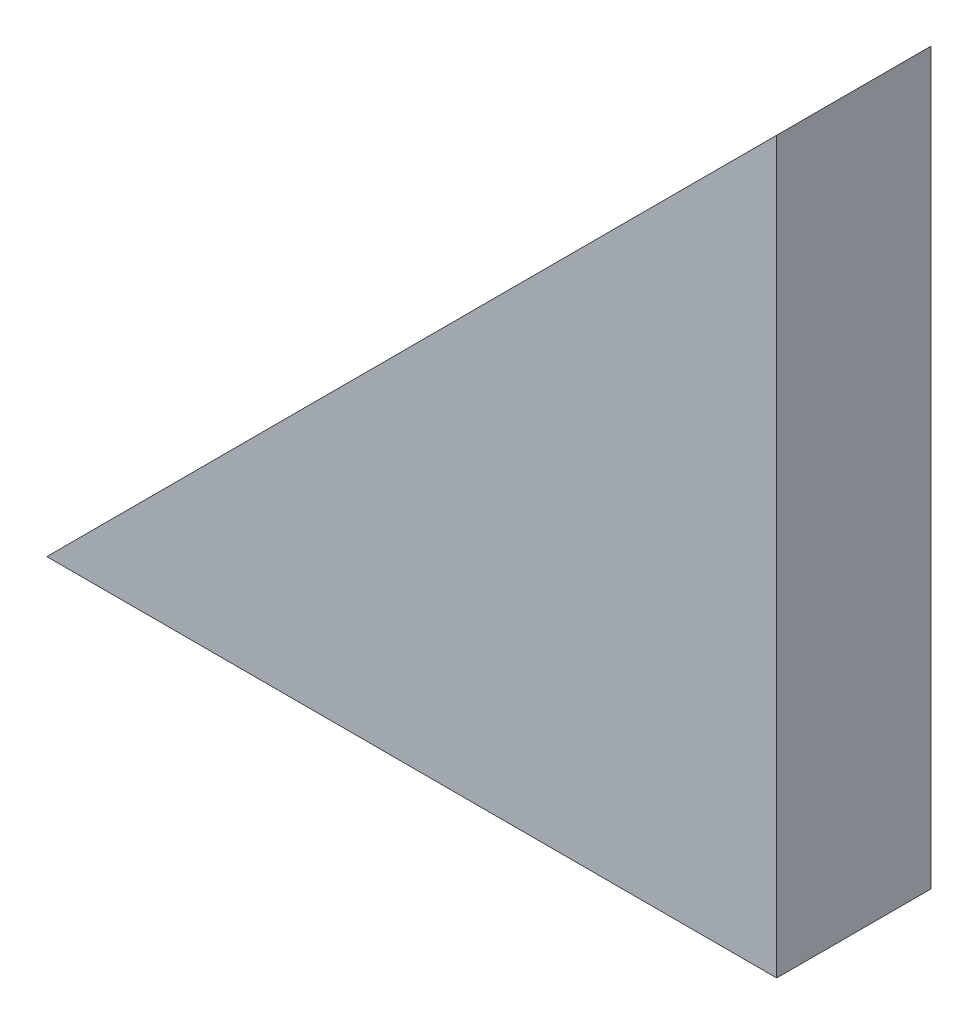
ISO-10303-21;
HEADER;
FILE_DESCRIPTION(('STEP AP214'),'2;1');
FILE_NAME('part.step','',(''),(''),'','','');
FILE_SCHEMA(('AUTOMOTIVE_DESIGN { 1 0 10303 214 1 1 1 1 }'));
ENDSEC;
DATA;
#1=APPLICATION_CONTEXT('core data for automotive mechanical design processes');
#2=APPLICATION_PROTOCOL_DEFINITION('international standard','automotive_design',2000,#1);
#3=PRODUCT_CONTEXT('',#1,'mechanical');
#4=PRODUCT('Part','Part','',(#3));
#5=PRODUCT_RELATED_PRODUCT_CATEGORY('part','',(#4));
#6=PRODUCT_DEFINITION_FORMATION('','',#4);
#7=PRODUCT_DEFINITION_CONTEXT('part definition',#1,'design');
#8=PRODUCT_DEFINITION('design','',#6,#7);
#9=PRODUCT_DEFINITION_SHAPE('','',#8);
#10=(LENGTH_UNIT() NAMED_UNIT(*) SI_UNIT(.MILLI.,.METRE.));
#11=(NAMED_UNIT(*) PLANE_ANGLE_UNIT() SI_UNIT($,.RADIAN.));
#12=(NAMED_UNIT(*) SI_UNIT($,.STERADIAN.) SOLID_ANGLE_UNIT());
#13=UNCERTAINTY_MEASURE_WITH_UNIT(LENGTH_MEASURE(1.E-05),#10,'distance_accuracy_value','');
#14=(GEOMETRIC_REPRESENTATION_CONTEXT(3) GLOBAL_UNCERTAINTY_ASSIGNED_CONTEXT((#13)) GLOBAL_UNIT_ASSIGNED_CONTEXT((#10,
#11,#12)) REPRESENTATION_CONTEXT('',''));
#15=CARTESIAN_POINT('',(0.,0.,0.));
#16=DIRECTION('',(0.,0.,1.));
#17=DIRECTION('',(1.,0.,0.));
#18=AXIS2_PLACEMENT_3D('',#15,#16,#17);
#19=CARTESIAN_POINT('',(0.,0.,9.525));
#20=DIRECTION('',(-1.,0.,0.));
#21=DIRECTION('',(0.,0.,1.));
#22=AXIS2_PLACEMENT_3D('',#19,#20,#21);
#23=PLANE('',#22);
#24=DIRECTION('',(0.,1.,0.));
#25=VECTOR('',#24,1.);
#26=CARTESIAN_POINT('',(0.,0.,0.));
#27=LINE('',#26,#25);
#28=CARTESIAN_POINT('',(0.,0.,0.));
#29=VERTEX_POINT('',#28);
#30=CARTESIAN_POINT('',(0.,45.,0.));
#31=VERTEX_POINT('',#30);
#32=EDGE_CURVE('E81',#29,#31,#27,.T.);
#33=ORIENTED_EDGE('',*,*,#32,.T.);
#34=DIRECTION('',(0.,0.,-1.));
#35=VECTOR('',#34,1.);
#36=CARTESIAN_POINT('',(0.,45.,9.525));
#37=LINE('',#36,#35);
#38=CARTESIAN_POINT('',(0.,45.,9.525));
#39=VERTEX_POINT('',#38);
#40=EDGE_CURVE('E11',#39,#31,#37,.T.);
#41=ORIENTED_EDGE('',*,*,#40,.F.);
#42=DIRECTION('',(0.,1.,0.));
#43=VECTOR('',#42,1.);
#44=CARTESIAN_POINT('',(0.,0.,9.525));
#45=LINE('',#44,#43);
#46=CARTESIAN_POINT('',(0.,0.,9.525));
#47=VERTEX_POINT('',#46);
#48=EDGE_CURVE('E74',#47,#39,#45,.T.);
#49=ORIENTED_EDGE('',*,*,#48,.F.);
#50=DIRECTION('',(0.,0.,-1.));
#51=VECTOR('',#50,1.);
#52=CARTESIAN_POINT('',(0.,0.,9.525));
#53=LINE('',#52,#51);
#54=EDGE_CURVE('E82',#47,#29,#53,.T.);
#55=ORIENTED_EDGE('',*,*,#54,.T.);
#56=EDGE_LOOP('',(#33,#41,#49,#55));
#57=FACE_BOUND('',#56,.T.);
#58=ADVANCED_FACE('F34',(#57),#23,.F.);
#59=CARTESIAN_POINT('',(0.,45.,9.525));
#60=DIRECTION('',(0.707106781186548,-0.707106781186547,0.));
#61=DIRECTION('',(0.707106781186547,0.707106781186548,0.));
#62=AXIS2_PLACEMENT_3D('',#59,#60,#61);
#63=PLANE('',#62);
#64=DIRECTION('',(-0.707106781186548,-0.707106781186548,0.));
#65=VECTOR('',#64,1.);
#66=CARTESIAN_POINT('',(0.,45.,0.));
#67=LINE('',#66,#65);
#68=CARTESIAN_POINT('',(-45.,0.,0.));
#69=VERTEX_POINT('',#68);
#70=EDGE_CURVE('E62',#31,#69,#67,.T.);
#71=ORIENTED_EDGE('',*,*,#70,.T.);
#72=DIRECTION('',(0.,0.,-1.));
#73=VECTOR('',#72,1.);
#74=CARTESIAN_POINT('',(-45.,0.,9.525));
#75=LINE('',#74,#73);
#76=CARTESIAN_POINT('',(-45.,0.,9.525));
#77=VERTEX_POINT('',#76);
#78=EDGE_CURVE('E42',#77,#69,#75,.T.);
#79=ORIENTED_EDGE('',*,*,#78,.F.);
#80=DIRECTION('',(-0.707106781186548,-0.707106781186548,0.));
#81=VECTOR('',#80,1.);
#82=CARTESIAN_POINT('',(0.,45.,9.525));
#83=LINE('',#82,#81);
#84=EDGE_CURVE('E70',#39,#77,#83,.T.);
#85=ORIENTED_EDGE('',*,*,#84,.F.);
#86=ORIENTED_EDGE('',*,*,#40,.T.);
#87=EDGE_LOOP('',(#71,#79,#85,#86));
#88=FACE_BOUND('',#87,.T.);
#89=ADVANCED_FACE('F71',(#88),#63,.F.);
#90=CARTESIAN_POINT('',(0.,0.,9.525));
#91=DIRECTION('',(0.,1.,0.));
#92=DIRECTION('',(-1.,0.,0.));
#93=AXIS2_PLACEMENT_3D('',#90,#91,#92);
#94=PLANE('',#93);
#95=DIRECTION('',(1.,0.,0.));
#96=VECTOR('',#95,1.);
#97=CARTESIAN_POINT('',(0.,0.,0.));
#98=LINE('',#97,#96);
#99=EDGE_CURVE('E67',#69,#29,#98,.T.);
#100=ORIENTED_EDGE('',*,*,#99,.T.);
#101=ORIENTED_EDGE('',*,*,#54,.F.);
#102=DIRECTION('',(1.,0.,0.));
#103=VECTOR('',#102,1.);
#104=CARTESIAN_POINT('',(0.,0.,9.525));
#105=LINE('',#104,#103);
#106=EDGE_CURVE('E50',#77,#47,#105,.T.);
#107=ORIENTED_EDGE('',*,*,#106,.F.);
#108=ORIENTED_EDGE('',*,*,#78,.T.);
#109=EDGE_LOOP('',(#100,#101,#107,#108));
#110=FACE_BOUND('',#109,.T.);
#111=ADVANCED_FACE('F89',(#110),#94,.F.);
#112=CARTESIAN_POINT('',(0.,0.,9.525));
#113=DIRECTION('',(0.,0.,1.));
#114=DIRECTION('',(1.,0.,0.));
#115=AXIS2_PLACEMENT_3D('',#112,#113,#114);
#116=PLANE('',#115);
#117=ORIENTED_EDGE('',*,*,#48,.T.);
#118=ORIENTED_EDGE('',*,*,#84,.T.);
#119=ORIENTED_EDGE('',*,*,#106,.T.);
#120=EDGE_LOOP('',(#117,#118,#119));
#121=FACE_BOUND('',#120,.T.);
#122=ADVANCED_FACE('F77',(#121),#116,.T.);
#123=CARTESIAN_POINT('',(0.,0.,0.));
#124=DIRECTION('',(0.,0.,1.));
#125=DIRECTION('',(1.,0.,0.));
#126=AXIS2_PLACEMENT_3D('',#123,#124,#125);
#127=PLANE('',#126);
#128=ORIENTED_EDGE('',*,*,#32,.F.);
#129=ORIENTED_EDGE('',*,*,#99,.F.);
#130=ORIENTED_EDGE('',*,*,#70,.F.);
#131=EDGE_LOOP('',(#128,#129,#130));
#132=FACE_BOUND('',#131,.T.);
#133=ADVANCED_FACE('F90',(#132),#127,.F.);
#134=CLOSED_SHELL('',(#58,#89,#111,#122,#133));
#135=MANIFOLD_SOLID_BREP('B2',#134);
#136=ADVANCED_BREP_SHAPE_REPRESENTATION('',(#18,#135),#14);
#137=SHAPE_DEFINITION_REPRESENTATION(#9,#136);
ENDSEC;
END-ISO-10303-21;
